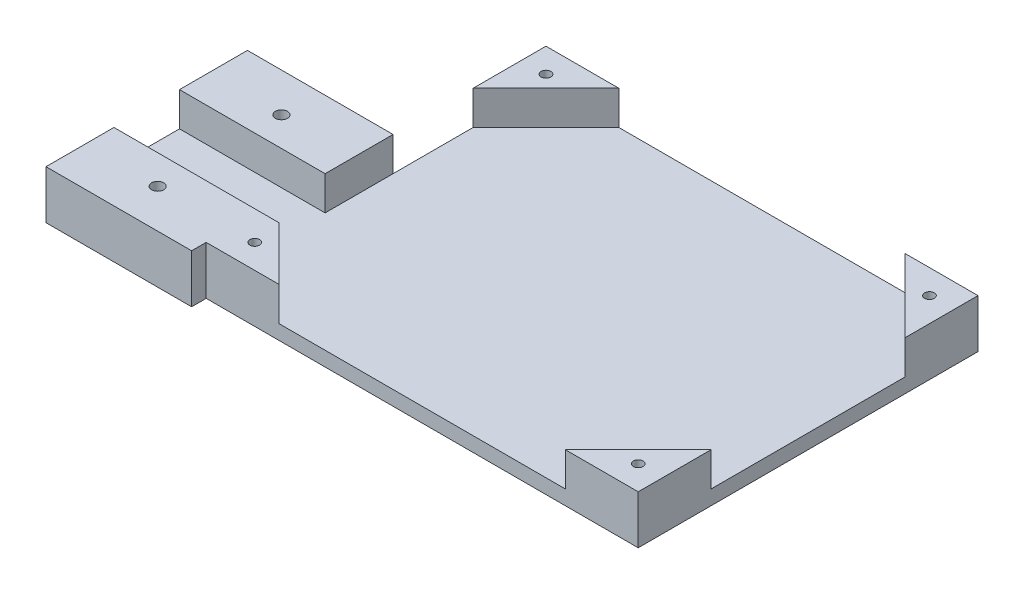
ISO-10303-21;
HEADER;
FILE_DESCRIPTION(('STEP AP214'),'2;1');
FILE_NAME('part.step','',(''),(''),'','','');
FILE_SCHEMA(('AUTOMOTIVE_DESIGN { 1 0 10303 214 1 1 1 1 }'));
ENDSEC;
DATA;
#1=APPLICATION_CONTEXT('core data for automotive mechanical design processes');
#2=APPLICATION_PROTOCOL_DEFINITION('international standard','automotive_design',2000,#1);
#3=PRODUCT_CONTEXT('',#1,'mechanical');
#4=PRODUCT('Part','Part','',(#3));
#5=PRODUCT_RELATED_PRODUCT_CATEGORY('part','',(#4));
#6=PRODUCT_DEFINITION_FORMATION('','',#4);
#7=PRODUCT_DEFINITION_CONTEXT('part definition',#1,'design');
#8=PRODUCT_DEFINITION('design','',#6,#7);
#9=PRODUCT_DEFINITION_SHAPE('','',#8);
#10=(LENGTH_UNIT() NAMED_UNIT(*) SI_UNIT(.MILLI.,.METRE.));
#11=(NAMED_UNIT(*) PLANE_ANGLE_UNIT() SI_UNIT($,.RADIAN.));
#12=(NAMED_UNIT(*) SI_UNIT($,.STERADIAN.) SOLID_ANGLE_UNIT());
#13=UNCERTAINTY_MEASURE_WITH_UNIT(LENGTH_MEASURE(1.E-05),#10,'distance_accuracy_value','');
#14=(GEOMETRIC_REPRESENTATION_CONTEXT(3) GLOBAL_UNCERTAINTY_ASSIGNED_CONTEXT((#13)) GLOBAL_UNIT_ASSIGNED_CONTEXT((#10,
#11,#12)) REPRESENTATION_CONTEXT('',''));
#15=CARTESIAN_POINT('',(0.,0.,0.));
#16=DIRECTION('',(0.,0.,1.));
#17=DIRECTION('',(1.,0.,0.));
#18=AXIS2_PLACEMENT_3D('',#15,#16,#17);
#19=CARTESIAN_POINT('',(0.,10.,0.));
#20=DIRECTION('',(0.,-1.,0.));
#21=DIRECTION('',(0.,0.,-1.));
#22=AXIS2_PLACEMENT_3D('',#19,#20,#21);
#23=PLANE('',#22);
#24=CARTESIAN_POINT('',(-59.5,10.,4.50000000000001));
#25=DIRECTION('',(0.,-1.,0.));
#26=DIRECTION('',(0.,0.,-1.));
#27=AXIS2_PLACEMENT_3D('',#24,#25,#26);
#28=CIRCLE('',#27,1.25);
#29=CARTESIAN_POINT('',(-59.5,10.,3.25));
#30=VERTEX_POINT('',#29);
#31=EDGE_CURVE('E213',#30,#30,#28,.T.);
#32=ORIENTED_EDGE('',*,*,#31,.T.);
#33=EDGE_LOOP('',(#32));
#34=FACE_BOUND('',#33,.T.);
#35=DIRECTION('',(0.,0.,-1.));
#36=VECTOR('',#35,1.);
#37=CARTESIAN_POINT('',(-74.5,10.,-3.49999999999999));
#38=LINE('',#37,#36);
#39=CARTESIAN_POINT('',(-74.5,10.,10.5));
#40=VERTEX_POINT('',#39);
#41=CARTESIAN_POINT('',(-74.5,10.,-3.49999999999999));
#42=VERTEX_POINT('',#41);
#43=EDGE_CURVE('E238',#40,#42,#38,.T.);
#44=ORIENTED_EDGE('',*,*,#43,.F.);
#45=DIRECTION('',(-1.,0.,0.));
#46=VECTOR('',#45,1.);
#47=CARTESIAN_POINT('',(-74.5,10.,10.5));
#48=LINE('',#47,#46);
#49=CARTESIAN_POINT('',(-44.5,10.,10.5));
#50=VERTEX_POINT('',#49);
#51=EDGE_CURVE('E195',#50,#40,#48,.T.);
#52=ORIENTED_EDGE('',*,*,#51,.F.);
#53=DIRECTION('',(0.,0.,1.));
#54=VECTOR('',#53,1.);
#55=CARTESIAN_POINT('',(-44.5,10.,-3.49999999999999));
#56=LINE('',#55,#54);
#57=CARTESIAN_POINT('',(-44.5,10.,-3.49999999999999));
#58=VERTEX_POINT('',#57);
#59=EDGE_CURVE('E229',#58,#50,#56,.T.);
#60=ORIENTED_EDGE('',*,*,#59,.F.);
#61=DIRECTION('',(1.,0.,0.));
#62=VECTOR('',#61,1.);
#63=CARTESIAN_POINT('',(-44.5,10.,-3.49999999999999));
#64=LINE('',#63,#62);
#65=EDGE_CURVE('E241',#42,#58,#64,.T.);
#66=ORIENTED_EDGE('',*,*,#65,.F.);
#67=EDGE_LOOP('',(#44,#52,#60,#66));
#68=FACE_BOUND('',#67,.T.);
#69=ADVANCED_FACE('F41',(#34,#68),#23,.F.);
#70=CARTESIAN_POINT('',(-44.5,10.,35.));
#71=DIRECTION('',(1.,0.,0.));
#72=DIRECTION('',(0.,0.,-1.));
#73=AXIS2_PLACEMENT_3D('',#70,#71,#72);
#74=PLANE('',#73);
#75=DIRECTION('',(0.,-1.,0.));
#76=VECTOR('',#75,1.);
#77=CARTESIAN_POINT('',(-44.5,10.,-3.49999999999999));
#78=LINE('',#77,#76);
#79=CARTESIAN_POINT('',(-44.5,3.,-3.49999999999999));
#80=VERTEX_POINT('',#79);
#81=CARTESIAN_POINT('',(-44.5,0.,-3.49999999999999));
#82=VERTEX_POINT('',#81);
#83=EDGE_CURVE('E11',#80,#82,#78,.T.);
#84=ORIENTED_EDGE('',*,*,#83,.F.);
#85=DIRECTION('',(0.,0.,1.));
#86=VECTOR('',#85,1.);
#87=CARTESIAN_POINT('',(-44.5,3.,-19.9999999999999));
#88=LINE('',#87,#86);
#89=CARTESIAN_POINT('',(-44.5,3.,-19.9999999999999));
#90=VERTEX_POINT('',#89);
#91=EDGE_CURVE('E272',#90,#80,#88,.T.);
#92=ORIENTED_EDGE('',*,*,#91,.F.);
#93=DIRECTION('',(0.,1.,0.));
#94=VECTOR('',#93,1.);
#95=CARTESIAN_POINT('',(-44.5,3.,-19.9999999999999));
#96=LINE('',#95,#94);
#97=CARTESIAN_POINT('',(-44.5,10.,-19.9999999999999));
#98=VERTEX_POINT('',#97);
#99=EDGE_CURVE('E314',#90,#98,#96,.T.);
#100=ORIENTED_EDGE('',*,*,#99,.T.);
#101=DIRECTION('',(0.,0.,1.));
#102=VECTOR('',#101,1.);
#103=CARTESIAN_POINT('',(-44.5,10.,35.));
#104=LINE('',#103,#102);
#105=CARTESIAN_POINT('',(-44.5,10.,-35.));
#106=VERTEX_POINT('',#105);
#107=EDGE_CURVE('E381',#106,#98,#104,.T.);
#108=ORIENTED_EDGE('',*,*,#107,.F.);
#109=DIRECTION('',(0.,-1.,0.));
#110=VECTOR('',#109,1.);
#111=CARTESIAN_POINT('',(-44.5,10.,-35.));
#112=LINE('',#111,#110);
#113=CARTESIAN_POINT('',(-44.5,0.,-35.));
#114=VERTEX_POINT('',#113);
#115=EDGE_CURVE('E408',#106,#114,#112,.T.);
#116=ORIENTED_EDGE('',*,*,#115,.T.);
#117=DIRECTION('',(0.,0.,1.));
#118=VECTOR('',#117,1.);
#119=CARTESIAN_POINT('',(-44.5,0.,35.));
#120=LINE('',#119,#118);
#121=EDGE_CURVE('E397',#114,#82,#120,.T.);
#122=ORIENTED_EDGE('',*,*,#121,.T.);
#123=EDGE_LOOP('',(#84,#92,#100,#108,#116,#122));
#124=FACE_BOUND('',#123,.T.);
#125=ADVANCED_FACE('F432',(#124),#74,.F.);
#126=CARTESIAN_POINT('',(-39.5,10.,-30.));
#127=DIRECTION('',(0.,1.,0.));
#128=DIRECTION('',(0.,0.,1.));
#129=AXIS2_PLACEMENT_3D('',#126,#127,#128);
#130=CIRCLE('',#129,0.999999999999998);
#131=CARTESIAN_POINT('',(-39.5,10.,-29.));
#132=VERTEX_POINT('',#131);
#133=EDGE_CURVE('E363',#132,#132,#130,.T.);
#134=ORIENTED_EDGE('',*,*,#133,.F.);
#135=EDGE_LOOP('',(#134));
#136=FACE_BOUND('',#135,.T.);
#137=ORIENTED_EDGE('',*,*,#107,.T.);
#138=DIRECTION('',(-0.707106781186544,0.,0.707106781186551));
#139=VECTOR('',#138,1.);
#140=CARTESIAN_POINT('',(-29.5000000000001,10.,-35.));
#141=LINE('',#140,#139);
#142=CARTESIAN_POINT('',(-29.5000000000001,10.,-35.));
#143=VERTEX_POINT('',#142);
#144=EDGE_CURVE('E311',#143,#98,#141,.T.);
#145=ORIENTED_EDGE('',*,*,#144,.F.);
#146=DIRECTION('',(-1.,0.,0.));
#147=VECTOR('',#146,1.);
#148=CARTESIAN_POINT('',(-44.5,10.,-35.));
#149=LINE('',#148,#147);
#150=EDGE_CURVE('E375',#143,#106,#149,.T.);
#151=ORIENTED_EDGE('',*,*,#150,.T.);
#152=EDGE_LOOP('',(#137,#145,#151));
#153=FACE_BOUND('',#152,.T.);
#154=ADVANCED_FACE('F490',(#136,#153),#23,.F.);
#155=CARTESIAN_POINT('',(39.5,10.,-30.));
#156=DIRECTION('',(0.,1.,0.));
#157=DIRECTION('',(0.,0.,-1.));
#158=AXIS2_PLACEMENT_3D('',#155,#156,#157);
#159=CIRCLE('',#158,0.999999999999998);
#160=CARTESIAN_POINT('',(39.5,10.,-31.));
#161=VERTEX_POINT('',#160);
#162=EDGE_CURVE('E355',#161,#161,#159,.T.);
#163=ORIENTED_EDGE('',*,*,#162,.F.);
#164=EDGE_LOOP('',(#163));
#165=FACE_BOUND('',#164,.T.);
#166=CARTESIAN_POINT('',(44.5,10.,-35.));
#167=VERTEX_POINT('',#166);
#168=CARTESIAN_POINT('',(29.4999999999999,10.,-35.));
#169=VERTEX_POINT('',#168);
#170=EDGE_CURVE('E377',#167,#169,#149,.T.);
#171=ORIENTED_EDGE('',*,*,#170,.T.);
#172=DIRECTION('',(-0.707106781186549,0.,-0.707106781186546));
#173=VECTOR('',#172,1.);
#174=CARTESIAN_POINT('',(44.5,10.,-20.));
#175=LINE('',#174,#173);
#176=CARTESIAN_POINT('',(44.5,10.,-20.));
#177=VERTEX_POINT('',#176);
#178=EDGE_CURVE('E308',#177,#169,#175,.T.);
#179=ORIENTED_EDGE('',*,*,#178,.F.);
#180=DIRECTION('',(0.,0.,-1.));
#181=VECTOR('',#180,1.);
#182=CARTESIAN_POINT('',(44.5,10.,35.));
#183=LINE('',#182,#181);
#184=EDGE_CURVE('E376',#177,#167,#183,.T.);
#185=ORIENTED_EDGE('',*,*,#184,.T.);
#186=EDGE_LOOP('',(#171,#179,#185));
#187=FACE_BOUND('',#186,.T.);
#188=ADVANCED_FACE('F497',(#165,#187),#23,.F.);
#189=CARTESIAN_POINT('',(39.5,10.,30.));
#190=DIRECTION('',(0.,1.,0.));
#191=DIRECTION('',(0.,0.,1.));
#192=AXIS2_PLACEMENT_3D('',#189,#190,#191);
#193=CIRCLE('',#192,0.999999999999998);
#194=CARTESIAN_POINT('',(39.5,10.,31.));
#195=VERTEX_POINT('',#194);
#196=EDGE_CURVE('E347',#195,#195,#193,.T.);
#197=ORIENTED_EDGE('',*,*,#196,.F.);
#198=EDGE_LOOP('',(#197));
#199=FACE_BOUND('',#198,.T.);
#200=CARTESIAN_POINT('',(44.5,10.,35.));
#201=VERTEX_POINT('',#200);
#202=CARTESIAN_POINT('',(44.5,10.,20.));
#203=VERTEX_POINT('',#202);
#204=EDGE_CURVE('E371',#201,#203,#183,.T.);
#205=ORIENTED_EDGE('',*,*,#204,.T.);
#206=DIRECTION('',(0.707106781186546,0.,-0.707106781186549));
#207=VECTOR('',#206,1.);
#208=CARTESIAN_POINT('',(29.5,10.,35.));
#209=LINE('',#208,#207);
#210=CARTESIAN_POINT('',(29.5,10.,35.));
#211=VERTEX_POINT('',#210);
#212=EDGE_CURVE('E305',#211,#203,#209,.T.);
#213=ORIENTED_EDGE('',*,*,#212,.F.);
#214=DIRECTION('',(1.,0.,0.));
#215=VECTOR('',#214,1.);
#216=CARTESIAN_POINT('',(-44.5,10.,35.));
#217=LINE('',#216,#215);
#218=EDGE_CURVE('E385',#211,#201,#217,.T.);
#219=ORIENTED_EDGE('',*,*,#218,.T.);
#220=EDGE_LOOP('',(#205,#213,#219));
#221=FACE_BOUND('',#220,.T.);
#222=ADVANCED_FACE('F480',(#199,#221),#23,.F.);
#223=DIRECTION('',(0.707106781186549,0.,0.707106781186546));
#224=VECTOR('',#223,1.);
#225=CARTESIAN_POINT('',(-44.5,10.,20.));
#226=LINE('',#225,#224);
#227=CARTESIAN_POINT('',(-40.5,10.,24.));
#228=VERTEX_POINT('',#227);
#229=CARTESIAN_POINT('',(-29.4999999999999,10.,35.));
#230=VERTEX_POINT('',#229);
#231=EDGE_CURVE('E262',#228,#230,#226,.T.);
#232=ORIENTED_EDGE('',*,*,#231,.F.);
#233=DIRECTION('',(1.,0.,0.));
#234=VECTOR('',#233,1.);
#235=CARTESIAN_POINT('',(-74.5,10.,24.));
#236=LINE('',#235,#234);
#237=CARTESIAN_POINT('',(-74.5,10.,24.));
#238=VERTEX_POINT('',#237);
#239=EDGE_CURVE('E446',#238,#228,#236,.T.);
#240=ORIENTED_EDGE('',*,*,#239,.F.);
#241=CARTESIAN_POINT('',(-74.5,10.,38.));
#242=VERTEX_POINT('',#241);
#243=EDGE_CURVE('E200',#242,#238,#38,.T.);
#244=ORIENTED_EDGE('',*,*,#243,.F.);
#245=DIRECTION('',(-1.,0.,0.));
#246=VECTOR('',#245,1.);
#247=CARTESIAN_POINT('',(-44.5,10.,38.));
#248=LINE('',#247,#246);
#249=CARTESIAN_POINT('',(-44.5,10.,38.));
#250=VERTEX_POINT('',#249);
#251=EDGE_CURVE('E233',#250,#242,#248,.T.);
#252=ORIENTED_EDGE('',*,*,#251,.F.);
#253=CARTESIAN_POINT('',(-44.5,10.,35.));
#254=VERTEX_POINT('',#253);
#255=EDGE_CURVE('E234',#254,#250,#56,.T.);
#256=ORIENTED_EDGE('',*,*,#255,.F.);
#257=EDGE_CURVE('E386',#254,#230,#217,.T.);
#258=ORIENTED_EDGE('',*,*,#257,.T.);
#259=EDGE_LOOP('',(#232,#240,#244,#252,#256,#258));
#260=FACE_BOUND('',#259,.T.);
#261=CARTESIAN_POINT('',(-39.5,10.,30.));
#262=DIRECTION('',(0.,1.,0.));
#263=DIRECTION('',(0.,0.,-1.));
#264=AXIS2_PLACEMENT_3D('',#261,#262,#263);
#265=CIRCLE('',#264,0.999999999999998);
#266=CARTESIAN_POINT('',(-39.5,10.,29.));
#267=VERTEX_POINT('',#266);
#268=EDGE_CURVE('E339',#267,#267,#265,.T.);
#269=ORIENTED_EDGE('',*,*,#268,.F.);
#270=EDGE_LOOP('',(#269));
#271=FACE_BOUND('',#270,.T.);
#272=CARTESIAN_POINT('',(-59.5,10.,30.));
#273=DIRECTION('',(0.,-1.,0.));
#274=DIRECTION('',(0.,0.,-1.));
#275=AXIS2_PLACEMENT_3D('',#272,#273,#274);
#276=CIRCLE('',#275,1.25);
#277=CARTESIAN_POINT('',(-59.5,10.,28.75));
#278=VERTEX_POINT('',#277);
#279=EDGE_CURVE('E221',#278,#278,#276,.T.);
#280=ORIENTED_EDGE('',*,*,#279,.T.);
#281=EDGE_LOOP('',(#280));
#282=FACE_BOUND('',#281,.T.);
#283=ADVANCED_FACE('F465',(#260,#271,#282),#23,.F.);
#284=CARTESIAN_POINT('',(0.,0.,0.));
#285=DIRECTION('',(0.,-1.,0.));
#286=DIRECTION('',(0.,0.,-1.));
#287=AXIS2_PLACEMENT_3D('',#284,#285,#286);
#288=PLANE('',#287);
#289=CARTESIAN_POINT('',(39.5,0.,30.));
#290=DIRECTION('',(0.,1.,0.));
#291=DIRECTION('',(0.,0.,1.));
#292=AXIS2_PLACEMENT_3D('',#289,#290,#291);
#293=CIRCLE('',#292,0.999999999999998);
#294=CARTESIAN_POINT('',(39.5,0.,31.));
#295=VERTEX_POINT('',#294);
#296=EDGE_CURVE('E343',#295,#295,#293,.T.);
#297=ORIENTED_EDGE('',*,*,#296,.T.);
#298=EDGE_LOOP('',(#297));
#299=FACE_BOUND('',#298,.T.);
#300=CARTESIAN_POINT('',(-39.5,0.,-30.));
#301=DIRECTION('',(0.,1.,0.));
#302=DIRECTION('',(0.,0.,1.));
#303=AXIS2_PLACEMENT_3D('',#300,#301,#302);
#304=CIRCLE('',#303,0.999999999999998);
#305=CARTESIAN_POINT('',(-39.5,0.,-29.));
#306=VERTEX_POINT('',#305);
#307=EDGE_CURVE('E359',#306,#306,#304,.T.);
#308=ORIENTED_EDGE('',*,*,#307,.T.);
#309=EDGE_LOOP('',(#308));
#310=FACE_BOUND('',#309,.T.);
#311=DIRECTION('',(0.,0.,-1.));
#312=VECTOR('',#311,1.);
#313=CARTESIAN_POINT('',(44.5,0.,35.));
#314=LINE('',#313,#312);
#315=CARTESIAN_POINT('',(44.5,0.,35.));
#316=VERTEX_POINT('',#315);
#317=CARTESIAN_POINT('',(44.5,0.,-35.));
#318=VERTEX_POINT('',#317);
#319=EDGE_CURVE('E367',#316,#318,#314,.T.);
#320=ORIENTED_EDGE('',*,*,#319,.F.);
#321=DIRECTION('',(1.,0.,0.));
#322=VECTOR('',#321,1.);
#323=CARTESIAN_POINT('',(-44.5,0.,35.));
#324=LINE('',#323,#322);
#325=CARTESIAN_POINT('',(-44.5,0.,35.));
#326=VERTEX_POINT('',#325);
#327=EDGE_CURVE('E400',#326,#316,#324,.T.);
#328=ORIENTED_EDGE('',*,*,#327,.F.);
#329=DIRECTION('',(0.,0.,1.));
#330=VECTOR('',#329,1.);
#331=CARTESIAN_POINT('',(-44.5,0.,-3.49999999999999));
#332=LINE('',#331,#330);
#333=CARTESIAN_POINT('',(-44.5,0.,38.));
#334=VERTEX_POINT('',#333);
#335=EDGE_CURVE('E225',#326,#334,#332,.T.);
#336=ORIENTED_EDGE('',*,*,#335,.T.);
#337=DIRECTION('',(-1.,0.,0.));
#338=VECTOR('',#337,1.);
#339=CARTESIAN_POINT('',(-44.5,0.,38.));
#340=LINE('',#339,#338);
#341=CARTESIAN_POINT('',(-74.5,0.,38.));
#342=VERTEX_POINT('',#341);
#343=EDGE_CURVE('E248',#334,#342,#340,.T.);
#344=ORIENTED_EDGE('',*,*,#343,.T.);
#345=DIRECTION('',(0.,0.,-1.));
#346=VECTOR('',#345,1.);
#347=CARTESIAN_POINT('',(-74.5,0.,-3.49999999999999));
#348=LINE('',#347,#346);
#349=CARTESIAN_POINT('',(-74.5,0.,-3.49999999999999));
#350=VERTEX_POINT('',#349);
#351=EDGE_CURVE('E252',#342,#350,#348,.T.);
#352=ORIENTED_EDGE('',*,*,#351,.T.);
#353=DIRECTION('',(1.,0.,0.));
#354=VECTOR('',#353,1.);
#355=CARTESIAN_POINT('',(-44.5,0.,-3.49999999999999));
#356=LINE('',#355,#354);
#357=EDGE_CURVE('E256',#350,#82,#356,.T.);
#358=ORIENTED_EDGE('',*,*,#357,.T.);
#359=ORIENTED_EDGE('',*,*,#121,.F.);
#360=DIRECTION('',(-1.,0.,0.));
#361=VECTOR('',#360,1.);
#362=CARTESIAN_POINT('',(-44.5,0.,-35.));
#363=LINE('',#362,#361);
#364=EDGE_CURVE('E394',#318,#114,#363,.T.);
#365=ORIENTED_EDGE('',*,*,#364,.F.);
#366=EDGE_LOOP('',(#320,#328,#336,#344,#352,#358,#359,#365));
#367=FACE_BOUND('',#366,.T.);
#368=CARTESIAN_POINT('',(39.5,0.,-30.));
#369=DIRECTION('',(0.,1.,0.));
#370=DIRECTION('',(0.,0.,-1.));
#371=AXIS2_PLACEMENT_3D('',#368,#369,#370);
#372=CIRCLE('',#371,0.999999999999998);
#373=CARTESIAN_POINT('',(39.5,0.,-31.));
#374=VERTEX_POINT('',#373);
#375=EDGE_CURVE('E351',#374,#374,#372,.T.);
#376=ORIENTED_EDGE('',*,*,#375,.T.);
#377=EDGE_LOOP('',(#376));
#378=FACE_BOUND('',#377,.T.);
#379=CARTESIAN_POINT('',(-39.5,0.,30.));
#380=DIRECTION('',(0.,1.,0.));
#381=DIRECTION('',(0.,0.,-1.));
#382=AXIS2_PLACEMENT_3D('',#379,#380,#381);
#383=CIRCLE('',#382,0.999999999999998);
#384=CARTESIAN_POINT('',(-39.5,0.,29.));
#385=VERTEX_POINT('',#384);
#386=EDGE_CURVE('E318',#385,#385,#383,.T.);
#387=ORIENTED_EDGE('',*,*,#386,.T.);
#388=EDGE_LOOP('',(#387));
#389=FACE_BOUND('',#388,.T.);
#390=CARTESIAN_POINT('',(-59.5,0.,4.50000000000001));
#391=DIRECTION('',(0.,-1.,0.));
#392=DIRECTION('',(0.,0.,-1.));
#393=AXIS2_PLACEMENT_3D('',#390,#391,#392);
#394=CIRCLE('',#393,1.25);
#395=CARTESIAN_POINT('',(-59.5,0.,3.25));
#396=VERTEX_POINT('',#395);
#397=EDGE_CURVE('E212',#396,#396,#394,.T.);
#398=ORIENTED_EDGE('',*,*,#397,.F.);
#399=EDGE_LOOP('',(#398));
#400=FACE_BOUND('',#399,.T.);
#401=CARTESIAN_POINT('',(-59.5,0.,30.));
#402=DIRECTION('',(0.,-1.,0.));
#403=DIRECTION('',(0.,0.,-1.));
#404=AXIS2_PLACEMENT_3D('',#401,#402,#403);
#405=CIRCLE('',#404,1.25);
#406=CARTESIAN_POINT('',(-59.5,0.,28.75));
#407=VERTEX_POINT('',#406);
#408=EDGE_CURVE('E217',#407,#407,#405,.T.);
#409=ORIENTED_EDGE('',*,*,#408,.F.);
#410=EDGE_LOOP('',(#409));
#411=FACE_BOUND('',#410,.T.);
#412=ADVANCED_FACE('F428',(#299,#310,#367,#378,#389,#400,#411),#288,.T.);
#413=CARTESIAN_POINT('',(44.5,10.,35.));
#414=DIRECTION('',(-1.,0.,0.));
#415=DIRECTION('',(0.,0.,1.));
#416=AXIS2_PLACEMENT_3D('',#413,#414,#415);
#417=PLANE('',#416);
#418=ORIENTED_EDGE('',*,*,#184,.F.);
#419=DIRECTION('',(0.,1.,0.));
#420=VECTOR('',#419,1.);
#421=CARTESIAN_POINT('',(44.5,3.,-20.));
#422=LINE('',#421,#420);
#423=CARTESIAN_POINT('',(44.5,3.,-20.));
#424=VERTEX_POINT('',#423);
#425=EDGE_CURVE('E326',#424,#177,#422,.T.);
#426=ORIENTED_EDGE('',*,*,#425,.F.);
#427=DIRECTION('',(0.,0.,-1.));
#428=VECTOR('',#427,1.);
#429=CARTESIAN_POINT('',(44.5,3.,20.));
#430=LINE('',#429,#428);
#431=CARTESIAN_POINT('',(44.5,3.,20.));
#432=VERTEX_POINT('',#431);
#433=EDGE_CURVE('E287',#432,#424,#430,.T.);
#434=ORIENTED_EDGE('',*,*,#433,.F.);
#435=DIRECTION('',(0.,1.,0.));
#436=VECTOR('',#435,1.);
#437=CARTESIAN_POINT('',(44.5,3.,20.));
#438=LINE('',#437,#436);
#439=EDGE_CURVE('E329',#432,#203,#438,.T.);
#440=ORIENTED_EDGE('',*,*,#439,.T.);
#441=ORIENTED_EDGE('',*,*,#204,.F.);
#442=DIRECTION('',(0.,-1.,0.));
#443=VECTOR('',#442,1.);
#444=CARTESIAN_POINT('',(44.5,10.,35.));
#445=LINE('',#444,#443);
#446=EDGE_CURVE('E390',#201,#316,#445,.T.);
#447=ORIENTED_EDGE('',*,*,#446,.T.);
#448=ORIENTED_EDGE('',*,*,#319,.T.);
#449=DIRECTION('',(0.,-1.,0.));
#450=VECTOR('',#449,1.);
#451=CARTESIAN_POINT('',(44.5,10.,-35.));
#452=LINE('',#451,#450);
#453=EDGE_CURVE('E45',#167,#318,#452,.T.);
#454=ORIENTED_EDGE('',*,*,#453,.F.);
#455=EDGE_LOOP('',(#418,#426,#434,#440,#441,#447,#448,#454));
#456=FACE_BOUND('',#455,.T.);
#457=ADVANCED_FACE('F43',(#456),#417,.F.);
#458=CARTESIAN_POINT('',(-44.5,10.,-35.));
#459=DIRECTION('',(0.,0.,1.));
#460=DIRECTION('',(1.,0.,0.));
#461=AXIS2_PLACEMENT_3D('',#458,#459,#460);
#462=PLANE('',#461);
#463=ORIENTED_EDGE('',*,*,#150,.F.);
#464=DIRECTION('',(0.,1.,0.));
#465=VECTOR('',#464,1.);
#466=CARTESIAN_POINT('',(-29.5000000000001,3.,-35.));
#467=LINE('',#466,#465);
#468=CARTESIAN_POINT('',(-29.5000000000001,3.,-35.));
#469=VERTEX_POINT('',#468);
#470=EDGE_CURVE('E319',#469,#143,#467,.T.);
#471=ORIENTED_EDGE('',*,*,#470,.F.);
#472=DIRECTION('',(-1.,0.,0.));
#473=VECTOR('',#472,1.);
#474=CARTESIAN_POINT('',(29.4999999999999,3.,-35.));
#475=LINE('',#474,#473);
#476=CARTESIAN_POINT('',(29.4999999999999,3.,-35.));
#477=VERTEX_POINT('',#476);
#478=EDGE_CURVE('E295',#477,#469,#475,.T.);
#479=ORIENTED_EDGE('',*,*,#478,.F.);
#480=DIRECTION('',(0.,1.,0.));
#481=VECTOR('',#480,1.);
#482=CARTESIAN_POINT('',(29.4999999999999,3.,-35.));
#483=LINE('',#482,#481);
#484=EDGE_CURVE('E322',#477,#169,#483,.T.);
#485=ORIENTED_EDGE('',*,*,#484,.T.);
#486=ORIENTED_EDGE('',*,*,#170,.F.);
#487=ORIENTED_EDGE('',*,*,#453,.T.);
#488=ORIENTED_EDGE('',*,*,#364,.T.);
#489=ORIENTED_EDGE('',*,*,#115,.F.);
#490=EDGE_LOOP('',(#463,#471,#479,#485,#486,#487,#488,#489));
#491=FACE_BOUND('',#490,.T.);
#492=ADVANCED_FACE('F420',(#491),#462,.F.);
#493=CARTESIAN_POINT('',(-44.5,10.,35.));
#494=DIRECTION('',(0.,0.,-1.));
#495=DIRECTION('',(-1.,0.,0.));
#496=AXIS2_PLACEMENT_3D('',#493,#494,#495);
#497=PLANE('',#496);
#498=ORIENTED_EDGE('',*,*,#218,.F.);
#499=DIRECTION('',(0.,1.,0.));
#500=VECTOR('',#499,1.);
#501=CARTESIAN_POINT('',(29.5,3.,35.));
#502=LINE('',#501,#500);
#503=CARTESIAN_POINT('',(29.5,3.,35.));
#504=VERTEX_POINT('',#503);
#505=EDGE_CURVE('E333',#504,#211,#502,.T.);
#506=ORIENTED_EDGE('',*,*,#505,.F.);
#507=DIRECTION('',(1.,0.,0.));
#508=VECTOR('',#507,1.);
#509=CARTESIAN_POINT('',(-29.4999999999999,3.,35.));
#510=LINE('',#509,#508);
#511=CARTESIAN_POINT('',(-29.4999999999999,3.,35.));
#512=VERTEX_POINT('',#511);
#513=EDGE_CURVE('E279',#512,#504,#510,.T.);
#514=ORIENTED_EDGE('',*,*,#513,.F.);
#515=DIRECTION('',(0.,1.,0.));
#516=VECTOR('',#515,1.);
#517=CARTESIAN_POINT('',(-29.4999999999999,3.,35.));
#518=LINE('',#517,#516);
#519=EDGE_CURVE('E302',#512,#230,#518,.T.);
#520=ORIENTED_EDGE('',*,*,#519,.T.);
#521=ORIENTED_EDGE('',*,*,#257,.F.);
#522=DIRECTION('',(0.,-1.,0.));
#523=VECTOR('',#522,1.);
#524=CARTESIAN_POINT('',(-44.5,10.,35.));
#525=LINE('',#524,#523);
#526=EDGE_CURVE('E406',#254,#326,#525,.T.);
#527=ORIENTED_EDGE('',*,*,#526,.T.);
#528=ORIENTED_EDGE('',*,*,#327,.T.);
#529=ORIENTED_EDGE('',*,*,#446,.F.);
#530=EDGE_LOOP('',(#498,#506,#514,#520,#521,#527,#528,#529));
#531=FACE_BOUND('',#530,.T.);
#532=ADVANCED_FACE('F475',(#531),#497,.F.);
#533=CARTESIAN_POINT('',(-39.5,10.,-30.));
#534=DIRECTION('',(0.,-1.,0.));
#535=DIRECTION('',(0.,0.,-1.));
#536=AXIS2_PLACEMENT_3D('',#533,#534,#535);
#537=CYLINDRICAL_SURFACE('',#536,0.999999999999998);
#538=ORIENTED_EDGE('',*,*,#133,.T.);
#539=EDGE_LOOP('',(#538));
#540=FACE_BOUND('',#539,.T.);
#541=ORIENTED_EDGE('',*,*,#307,.F.);
#542=EDGE_LOOP('',(#541));
#543=FACE_BOUND('',#542,.T.);
#544=ADVANCED_FACE('F541',(#540,#543),#537,.F.);
#545=CARTESIAN_POINT('',(39.5,10.,-30.));
#546=DIRECTION('',(0.,-1.,0.));
#547=DIRECTION('',(0.,0.,-1.));
#548=AXIS2_PLACEMENT_3D('',#545,#546,#547);
#549=CYLINDRICAL_SURFACE('',#548,0.999999999999998);
#550=ORIENTED_EDGE('',*,*,#162,.T.);
#551=EDGE_LOOP('',(#550));
#552=FACE_BOUND('',#551,.T.);
#553=ORIENTED_EDGE('',*,*,#375,.F.);
#554=EDGE_LOOP('',(#553));
#555=FACE_BOUND('',#554,.T.);
#556=ADVANCED_FACE('F535',(#552,#555),#549,.F.);
#557=CARTESIAN_POINT('',(39.5,10.,30.));
#558=DIRECTION('',(0.,-1.,0.));
#559=DIRECTION('',(0.,0.,-1.));
#560=AXIS2_PLACEMENT_3D('',#557,#558,#559);
#561=CYLINDRICAL_SURFACE('',#560,0.999999999999998);
#562=ORIENTED_EDGE('',*,*,#196,.T.);
#563=EDGE_LOOP('',(#562));
#564=FACE_BOUND('',#563,.T.);
#565=ORIENTED_EDGE('',*,*,#296,.F.);
#566=EDGE_LOOP('',(#565));
#567=FACE_BOUND('',#566,.T.);
#568=ADVANCED_FACE('F532',(#564,#567),#561,.F.);
#569=CARTESIAN_POINT('',(-39.5,10.,30.));
#570=DIRECTION('',(0.,-1.,0.));
#571=DIRECTION('',(0.,0.,-1.));
#572=AXIS2_PLACEMENT_3D('',#569,#570,#571);
#573=CYLINDRICAL_SURFACE('',#572,0.999999999999998);
#574=ORIENTED_EDGE('',*,*,#268,.T.);
#575=EDGE_LOOP('',(#574));
#576=FACE_BOUND('',#575,.T.);
#577=ORIENTED_EDGE('',*,*,#386,.F.);
#578=EDGE_LOOP('',(#577));
#579=FACE_BOUND('',#578,.T.);
#580=ADVANCED_FACE('F506',(#576,#579),#573,.F.);
#581=CARTESIAN_POINT('',(-29.5000000000001,3.,-35.));
#582=DIRECTION('',(-0.707106781186551,0.,-0.707106781186544));
#583=DIRECTION('',(-0.707106781186544,0.,0.707106781186551));
#584=AXIS2_PLACEMENT_3D('',#581,#582,#583);
#585=PLANE('',#584);
#586=ORIENTED_EDGE('',*,*,#144,.T.);
#587=ORIENTED_EDGE('',*,*,#99,.F.);
#588=DIRECTION('',(-0.707106781186544,0.,0.707106781186551));
#589=VECTOR('',#588,1.);
#590=CARTESIAN_POINT('',(-29.5000000000001,3.,-35.));
#591=LINE('',#590,#589);
#592=EDGE_CURVE('E298',#469,#90,#591,.T.);
#593=ORIENTED_EDGE('',*,*,#592,.F.);
#594=ORIENTED_EDGE('',*,*,#470,.T.);
#595=EDGE_LOOP('',(#586,#587,#593,#594));
#596=FACE_BOUND('',#595,.T.);
#597=ADVANCED_FACE('F488',(#596),#585,.F.);
#598=CARTESIAN_POINT('',(44.5,3.,-20.));
#599=DIRECTION('',(0.707106781186546,0.,-0.707106781186549));
#600=DIRECTION('',(-0.707106781186549,0.,-0.707106781186546));
#601=AXIS2_PLACEMENT_3D('',#598,#599,#600);
#602=PLANE('',#601);
#603=ORIENTED_EDGE('',*,*,#178,.T.);
#604=ORIENTED_EDGE('',*,*,#484,.F.);
#605=DIRECTION('',(-0.707106781186549,0.,-0.707106781186546));
#606=VECTOR('',#605,1.);
#607=CARTESIAN_POINT('',(44.5,3.,-20.));
#608=LINE('',#607,#606);
#609=EDGE_CURVE('E291',#424,#477,#608,.T.);
#610=ORIENTED_EDGE('',*,*,#609,.F.);
#611=ORIENTED_EDGE('',*,*,#425,.T.);
#612=EDGE_LOOP('',(#603,#604,#610,#611));
#613=FACE_BOUND('',#612,.T.);
#614=ADVANCED_FACE('F498',(#613),#602,.F.);
#615=CARTESIAN_POINT('',(29.5,3.,35.));
#616=DIRECTION('',(0.707106781186549,0.,0.707106781186546));
#617=DIRECTION('',(0.707106781186546,0.,-0.707106781186549));
#618=AXIS2_PLACEMENT_3D('',#615,#616,#617);
#619=PLANE('',#618);
#620=ORIENTED_EDGE('',*,*,#212,.T.);
#621=ORIENTED_EDGE('',*,*,#439,.F.);
#622=DIRECTION('',(0.707106781186546,0.,-0.707106781186549));
#623=VECTOR('',#622,1.);
#624=CARTESIAN_POINT('',(29.5,3.,35.));
#625=LINE('',#624,#623);
#626=EDGE_CURVE('E283',#504,#432,#625,.T.);
#627=ORIENTED_EDGE('',*,*,#626,.F.);
#628=ORIENTED_EDGE('',*,*,#505,.T.);
#629=EDGE_LOOP('',(#620,#621,#627,#628));
#630=FACE_BOUND('',#629,.T.);
#631=ADVANCED_FACE('F478',(#630),#619,.F.);
#632=CARTESIAN_POINT('',(-44.5,3.,20.));
#633=DIRECTION('',(-0.707106781186546,0.,0.707106781186549));
#634=DIRECTION('',(0.707106781186549,0.,0.707106781186546));
#635=AXIS2_PLACEMENT_3D('',#632,#633,#634);
#636=PLANE('',#635);
#637=DIRECTION('',(0.707106781186549,0.,0.707106781186546));
#638=VECTOR('',#637,1.);
#639=CARTESIAN_POINT('',(-44.5,3.,20.));
#640=LINE('',#639,#638);
#641=CARTESIAN_POINT('',(-40.5,3.,24.));
#642=VERTEX_POINT('',#641);
#643=EDGE_CURVE('E275',#642,#512,#640,.T.);
#644=ORIENTED_EDGE('',*,*,#643,.F.);
#645=DIRECTION('',(0.,1.,0.));
#646=VECTOR('',#645,1.);
#647=CARTESIAN_POINT('',(-40.5,3.,24.));
#648=LINE('',#647,#646);
#649=EDGE_CURVE('E183',#642,#228,#648,.T.);
#650=ORIENTED_EDGE('',*,*,#649,.T.);
#651=ORIENTED_EDGE('',*,*,#231,.T.);
#652=ORIENTED_EDGE('',*,*,#519,.F.);
#653=EDGE_LOOP('',(#644,#650,#651,#652));
#654=FACE_BOUND('',#653,.T.);
#655=ADVANCED_FACE('F468',(#654),#636,.F.);
#656=CARTESIAN_POINT('',(0.,3.,0.));
#657=DIRECTION('',(0.,1.,0.));
#658=DIRECTION('',(0.,0.,1.));
#659=AXIS2_PLACEMENT_3D('',#656,#657,#658);
#660=PLANE('',#659);
#661=DIRECTION('',(1.,0.,0.));
#662=VECTOR('',#661,1.);
#663=CARTESIAN_POINT('',(-74.5,3.,24.));
#664=LINE('',#663,#662);
#665=CARTESIAN_POINT('',(-74.5,3.,24.));
#666=VERTEX_POINT('',#665);
#667=EDGE_CURVE('E176',#666,#642,#664,.T.);
#668=ORIENTED_EDGE('',*,*,#667,.T.);
#669=ORIENTED_EDGE('',*,*,#643,.T.);
#670=ORIENTED_EDGE('',*,*,#513,.T.);
#671=ORIENTED_EDGE('',*,*,#626,.T.);
#672=ORIENTED_EDGE('',*,*,#433,.T.);
#673=ORIENTED_EDGE('',*,*,#609,.T.);
#674=ORIENTED_EDGE('',*,*,#478,.T.);
#675=ORIENTED_EDGE('',*,*,#592,.T.);
#676=ORIENTED_EDGE('',*,*,#91,.T.);
#677=CARTESIAN_POINT('',(-44.5,3.,10.5));
#678=VERTEX_POINT('',#677);
#679=EDGE_CURVE('E276',#80,#678,#88,.T.);
#680=ORIENTED_EDGE('',*,*,#679,.T.);
#681=DIRECTION('',(-1.,0.,0.));
#682=VECTOR('',#681,1.);
#683=CARTESIAN_POINT('',(-74.5,3.,10.5));
#684=LINE('',#683,#682);
#685=CARTESIAN_POINT('',(-74.5,3.,10.5));
#686=VERTEX_POINT('',#685);
#687=EDGE_CURVE('E187',#678,#686,#684,.T.);
#688=ORIENTED_EDGE('',*,*,#687,.T.);
#689=DIRECTION('',(0.,0.,1.));
#690=VECTOR('',#689,1.);
#691=CARTESIAN_POINT('',(-74.5,3.,10.5));
#692=LINE('',#691,#690);
#693=EDGE_CURVE('E188',#686,#666,#692,.T.);
#694=ORIENTED_EDGE('',*,*,#693,.T.);
#695=EDGE_LOOP('',(#668,#669,#670,#671,#672,#673,#674,#675,#676,#680,#688,#694));
#696=FACE_BOUND('',#695,.T.);
#697=ADVANCED_FACE('F191',(#696),#660,.T.);
#698=CARTESIAN_POINT('',(-44.5,10.,-3.49999999999999));
#699=DIRECTION('',(1.,0.,0.));
#700=DIRECTION('',(0.,0.,-1.));
#701=AXIS2_PLACEMENT_3D('',#698,#699,#700);
#702=PLANE('',#701);
#703=ORIENTED_EDGE('',*,*,#526,.F.);
#704=ORIENTED_EDGE('',*,*,#255,.T.);
#705=DIRECTION('',(0.,-1.,0.));
#706=VECTOR('',#705,1.);
#707=CARTESIAN_POINT('',(-44.5,10.,38.));
#708=LINE('',#707,#706);
#709=EDGE_CURVE('E245',#250,#334,#708,.T.);
#710=ORIENTED_EDGE('',*,*,#709,.T.);
#711=ORIENTED_EDGE('',*,*,#335,.F.);
#712=EDGE_LOOP('',(#703,#704,#710,#711));
#713=FACE_BOUND('',#712,.T.);
#714=ADVANCED_FACE('F458',(#713),#702,.T.);
#715=DIRECTION('',(0.,1.,0.));
#716=VECTOR('',#715,1.);
#717=CARTESIAN_POINT('',(-44.5,10.,10.5));
#718=LINE('',#717,#716);
#719=EDGE_CURVE('E209',#678,#50,#718,.T.);
#720=ORIENTED_EDGE('',*,*,#719,.F.);
#721=ORIENTED_EDGE('',*,*,#679,.F.);
#722=EDGE_CURVE('E52',#58,#80,#78,.T.);
#723=ORIENTED_EDGE('',*,*,#722,.F.);
#724=ORIENTED_EDGE('',*,*,#59,.T.);
#725=EDGE_LOOP('',(#720,#721,#723,#724));
#726=FACE_BOUND('',#725,.T.);
#727=ADVANCED_FACE('F441',(#726),#702,.T.);
#728=CARTESIAN_POINT('',(-44.5,10.,-3.49999999999999));
#729=DIRECTION('',(0.,0.,-1.));
#730=DIRECTION('',(-1.,0.,0.));
#731=AXIS2_PLACEMENT_3D('',#728,#729,#730);
#732=PLANE('',#731);
#733=ORIENTED_EDGE('',*,*,#357,.F.);
#734=DIRECTION('',(0.,-1.,0.));
#735=VECTOR('',#734,1.);
#736=CARTESIAN_POINT('',(-74.5,10.,-3.49999999999999));
#737=LINE('',#736,#735);
#738=EDGE_CURVE('E263',#42,#350,#737,.T.);
#739=ORIENTED_EDGE('',*,*,#738,.F.);
#740=ORIENTED_EDGE('',*,*,#65,.T.);
#741=ORIENTED_EDGE('',*,*,#722,.T.);
#742=ORIENTED_EDGE('',*,*,#83,.T.);
#743=EDGE_LOOP('',(#733,#739,#740,#741,#742));
#744=FACE_BOUND('',#743,.T.);
#745=ADVANCED_FACE('F434',(#744),#732,.T.);
#746=CARTESIAN_POINT('',(-74.5,10.,-3.49999999999999));
#747=DIRECTION('',(-1.,0.,0.));
#748=DIRECTION('',(0.,0.,1.));
#749=AXIS2_PLACEMENT_3D('',#746,#747,#748);
#750=PLANE('',#749);
#751=DIRECTION('',(0.,1.,0.));
#752=VECTOR('',#751,1.);
#753=CARTESIAN_POINT('',(-74.5,3.,10.5));
#754=LINE('',#753,#752);
#755=EDGE_CURVE('E59',#686,#40,#754,.T.);
#756=ORIENTED_EDGE('',*,*,#755,.T.);
#757=ORIENTED_EDGE('',*,*,#43,.T.);
#758=ORIENTED_EDGE('',*,*,#738,.T.);
#759=ORIENTED_EDGE('',*,*,#351,.F.);
#760=DIRECTION('',(0.,-1.,0.));
#761=VECTOR('',#760,1.);
#762=CARTESIAN_POINT('',(-74.5,10.,38.));
#763=LINE('',#762,#761);
#764=EDGE_CURVE('E266',#242,#342,#763,.T.);
#765=ORIENTED_EDGE('',*,*,#764,.F.);
#766=ORIENTED_EDGE('',*,*,#243,.T.);
#767=DIRECTION('',(0.,1.,0.));
#768=VECTOR('',#767,1.);
#769=CARTESIAN_POINT('',(-74.5,3.,24.));
#770=LINE('',#769,#768);
#771=EDGE_CURVE('E180',#666,#238,#770,.T.);
#772=ORIENTED_EDGE('',*,*,#771,.F.);
#773=ORIENTED_EDGE('',*,*,#693,.F.);
#774=EDGE_LOOP('',(#756,#757,#758,#759,#765,#766,#772,#773));
#775=FACE_BOUND('',#774,.T.);
#776=ADVANCED_FACE('F198',(#775),#750,.T.);
#777=CARTESIAN_POINT('',(-44.5,10.,38.));
#778=DIRECTION('',(0.,0.,1.));
#779=DIRECTION('',(1.,0.,0.));
#780=AXIS2_PLACEMENT_3D('',#777,#778,#779);
#781=PLANE('',#780);
#782=ORIENTED_EDGE('',*,*,#343,.F.);
#783=ORIENTED_EDGE('',*,*,#709,.F.);
#784=ORIENTED_EDGE('',*,*,#251,.T.);
#785=ORIENTED_EDGE('',*,*,#764,.T.);
#786=EDGE_LOOP('',(#782,#783,#784,#785));
#787=FACE_BOUND('',#786,.T.);
#788=ADVANCED_FACE('F463',(#787),#781,.T.);
#789=CARTESIAN_POINT('',(-59.5,10.,30.));
#790=DIRECTION('',(0.,-1.,0.));
#791=DIRECTION('',(0.,0.,-1.));
#792=AXIS2_PLACEMENT_3D('',#789,#790,#791);
#793=CYLINDRICAL_SURFACE('',#792,1.25);
#794=ORIENTED_EDGE('',*,*,#279,.F.);
#795=EDGE_LOOP('',(#794));
#796=FACE_BOUND('',#795,.T.);
#797=ORIENTED_EDGE('',*,*,#408,.T.);
#798=EDGE_LOOP('',(#797));
#799=FACE_BOUND('',#798,.T.);
#800=ADVANCED_FACE('F567',(#796,#799),#793,.F.);
#801=CARTESIAN_POINT('',(-59.5,10.,4.50000000000001));
#802=DIRECTION('',(0.,-1.,0.));
#803=DIRECTION('',(0.,0.,-1.));
#804=AXIS2_PLACEMENT_3D('',#801,#802,#803);
#805=CYLINDRICAL_SURFACE('',#804,1.25);
#806=ORIENTED_EDGE('',*,*,#31,.F.);
#807=EDGE_LOOP('',(#806));
#808=FACE_BOUND('',#807,.T.);
#809=ORIENTED_EDGE('',*,*,#397,.T.);
#810=EDGE_LOOP('',(#809));
#811=FACE_BOUND('',#810,.T.);
#812=ADVANCED_FACE('F574',(#808,#811),#805,.F.);
#813=CARTESIAN_POINT('',(-74.5,3.,10.5));
#814=DIRECTION('',(0.,0.,-1.));
#815=DIRECTION('',(-1.,0.,0.));
#816=AXIS2_PLACEMENT_3D('',#813,#814,#815);
#817=PLANE('',#816);
#818=ORIENTED_EDGE('',*,*,#719,.T.);
#819=ORIENTED_EDGE('',*,*,#51,.T.);
#820=ORIENTED_EDGE('',*,*,#755,.F.);
#821=ORIENTED_EDGE('',*,*,#687,.F.);
#822=EDGE_LOOP('',(#818,#819,#820,#821));
#823=FACE_BOUND('',#822,.T.);
#824=ADVANCED_FACE('F578',(#823),#817,.F.);
#825=CARTESIAN_POINT('',(-74.5,3.,24.));
#826=DIRECTION('',(0.,0.,1.));
#827=DIRECTION('',(1.,0.,0.));
#828=AXIS2_PLACEMENT_3D('',#825,#826,#827);
#829=PLANE('',#828);
#830=ORIENTED_EDGE('',*,*,#239,.T.);
#831=ORIENTED_EDGE('',*,*,#649,.F.);
#832=ORIENTED_EDGE('',*,*,#667,.F.);
#833=ORIENTED_EDGE('',*,*,#771,.T.);
#834=EDGE_LOOP('',(#830,#831,#832,#833));
#835=FACE_BOUND('',#834,.T.);
#836=ADVANCED_FACE('F178',(#835),#829,.F.);
#837=CLOSED_SHELL('',(#69,#125,#154,#188,#222,#283,#412,#457,#492,#532,#544,#556,#568,#580,#597,
#614,#631,#655,#697,#714,#727,#745,#776,#788,#800,#812,#824,#836));
#838=MANIFOLD_SOLID_BREP('B2',#837);
#839=ADVANCED_BREP_SHAPE_REPRESENTATION('',(#18,#838),#14);
#840=SHAPE_DEFINITION_REPRESENTATION(#9,#839);
ENDSEC;
END-ISO-10303-21;
